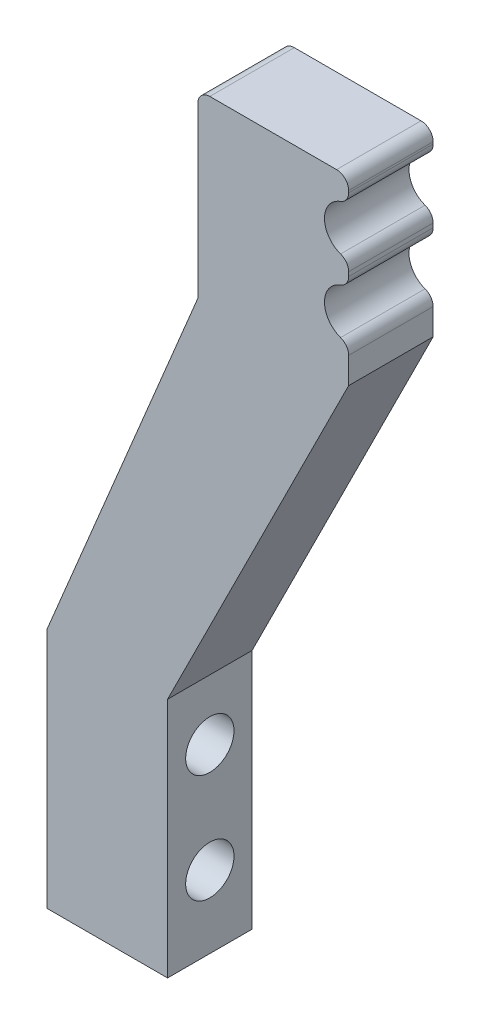
ISO-10303-21;
HEADER;
FILE_DESCRIPTION(('STEP AP214'),'2;1');
FILE_NAME('part.step','',(''),(''),'','','');
FILE_SCHEMA(('AUTOMOTIVE_DESIGN { 1 0 10303 214 1 1 1 1 }'));
ENDSEC;
DATA;
#1=APPLICATION_CONTEXT('core data for automotive mechanical design processes');
#2=APPLICATION_PROTOCOL_DEFINITION('international standard','automotive_design',2000,#1);
#3=PRODUCT_CONTEXT('',#1,'mechanical');
#4=PRODUCT('Part','Part','',(#3));
#5=PRODUCT_RELATED_PRODUCT_CATEGORY('part','',(#4));
#6=PRODUCT_DEFINITION_FORMATION('','',#4);
#7=PRODUCT_DEFINITION_CONTEXT('part definition',#1,'design');
#8=PRODUCT_DEFINITION('design','',#6,#7);
#9=PRODUCT_DEFINITION_SHAPE('','',#8);
#10=(LENGTH_UNIT() NAMED_UNIT(*) SI_UNIT(.MILLI.,.METRE.));
#11=(NAMED_UNIT(*) PLANE_ANGLE_UNIT() SI_UNIT($,.RADIAN.));
#12=(NAMED_UNIT(*) SI_UNIT($,.STERADIAN.) SOLID_ANGLE_UNIT());
#13=UNCERTAINTY_MEASURE_WITH_UNIT(LENGTH_MEASURE(1.E-05),#10,'distance_accuracy_value','');
#14=(GEOMETRIC_REPRESENTATION_CONTEXT(3) GLOBAL_UNCERTAINTY_ASSIGNED_CONTEXT((#13)) GLOBAL_UNIT_ASSIGNED_CONTEXT((#10,
#11,#12)) REPRESENTATION_CONTEXT('',''));
#15=CARTESIAN_POINT('',(0.,0.,0.));
#16=DIRECTION('',(0.,0.,1.));
#17=DIRECTION('',(1.,0.,0.));
#18=AXIS2_PLACEMENT_3D('',#15,#16,#17);
#19=CARTESIAN_POINT('',(-12.2781065088758,244.304733727811,70.));
#20=DIRECTION('',(-1.,0.,0.));
#21=DIRECTION('',(0.,0.,1.));
#22=AXIS2_PLACEMENT_3D('',#19,#20,#21);
#23=PLANE('',#22);
#24=DIRECTION('',(0.,0.,1.));
#25=VECTOR('',#24,1.);
#26=CARTESIAN_POINT('',(-12.2781065088758,234.304733727811,-9.00000000000001));
#27=LINE('',#26,#25);
#28=CARTESIAN_POINT('',(-12.2781065088758,234.304733727811,0.));
#29=VERTEX_POINT('',#28);
#30=CARTESIAN_POINT('',(-12.2781065088758,234.304733727811,70.));
#31=VERTEX_POINT('',#30);
#32=EDGE_CURVE('E52',#29,#31,#27,.T.);
#33=ORIENTED_EDGE('',*,*,#32,.T.);
#34=DIRECTION('',(0.,1.,0.));
#35=VECTOR('',#34,1.);
#36=CARTESIAN_POINT('',(-12.2781065088758,244.304733727811,70.));
#37=LINE('',#36,#35);
#38=CARTESIAN_POINT('',(-12.2781065088758,232.589004975272,70.));
#39=VERTEX_POINT('',#38);
#40=EDGE_CURVE('E171',#39,#31,#37,.T.);
#41=ORIENTED_EDGE('',*,*,#40,.F.);
#42=DIRECTION('',(0.,0.,1.));
#43=VECTOR('',#42,1.);
#44=CARTESIAN_POINT('',(-12.2781065088758,232.589004975272,-9.00000000000001));
#45=LINE('',#44,#43);
#46=CARTESIAN_POINT('',(-12.2781065088758,232.589004975272,0.));
#47=VERTEX_POINT('',#46);
#48=EDGE_CURVE('E263',#47,#39,#45,.T.);
#49=ORIENTED_EDGE('',*,*,#48,.F.);
#50=DIRECTION('',(0.,1.,0.));
#51=VECTOR('',#50,1.);
#52=CARTESIAN_POINT('',(-12.2781065088758,244.304733727811,0.));
#53=LINE('',#52,#51);
#54=EDGE_CURVE('E173',#47,#29,#53,.T.);
#55=ORIENTED_EDGE('',*,*,#54,.T.);
#56=EDGE_LOOP('',(#33,#41,#49,#55));
#57=FACE_BOUND('',#56,.T.);
#58=ADVANCED_FACE('F38',(#57),#23,.F.);
#59=DIRECTION('',(0.,0.,1.));
#60=VECTOR('',#59,1.);
#61=CARTESIAN_POINT('',(-12.2781065088757,176.020462480349,-9.00000000000001));
#62=LINE('',#61,#60);
#63=CARTESIAN_POINT('',(-12.2781065088757,176.020462480349,0.));
#64=VERTEX_POINT('',#63);
#65=CARTESIAN_POINT('',(-12.2781065088757,176.020462480349,70.));
#66=VERTEX_POINT('',#65);
#67=EDGE_CURVE('E258',#64,#66,#62,.T.);
#68=ORIENTED_EDGE('',*,*,#67,.T.);
#69=CARTESIAN_POINT('',(-12.2781065088757,172.589004975272,70.));
#70=VERTEX_POINT('',#69);
#71=EDGE_CURVE('E179',#70,#66,#37,.T.);
#72=ORIENTED_EDGE('',*,*,#71,.F.);
#73=DIRECTION('',(0.,0.,1.));
#74=VECTOR('',#73,1.);
#75=CARTESIAN_POINT('',(-12.2781065088757,172.589004975272,-9.00000000000001));
#76=LINE('',#75,#74);
#77=CARTESIAN_POINT('',(-12.2781065088757,172.589004975272,0.));
#78=VERTEX_POINT('',#77);
#79=EDGE_CURVE('E344',#78,#70,#76,.T.);
#80=ORIENTED_EDGE('',*,*,#79,.F.);
#81=EDGE_CURVE('E205',#78,#64,#53,.T.);
#82=ORIENTED_EDGE('',*,*,#81,.T.);
#83=EDGE_LOOP('',(#68,#72,#80,#82));
#84=FACE_BOUND('',#83,.T.);
#85=ADVANCED_FACE('F355',(#84),#23,.F.);
#86=DIRECTION('',(0.,0.,1.));
#87=VECTOR('',#86,1.);
#88=CARTESIAN_POINT('',(-12.2781065088758,116.020462480349,-9.00000000000001));
#89=LINE('',#88,#87);
#90=CARTESIAN_POINT('',(-12.2781065088758,116.020462480349,0.));
#91=VERTEX_POINT('',#90);
#92=CARTESIAN_POINT('',(-12.2781065088758,116.020462480349,70.));
#93=VERTEX_POINT('',#92);
#94=EDGE_CURVE('E338',#91,#93,#89,.T.);
#95=ORIENTED_EDGE('',*,*,#94,.T.);
#96=CARTESIAN_POINT('',(-12.2781065088758,94.3047337278106,70.));
#97=VERTEX_POINT('',#96);
#98=EDGE_CURVE('E182',#97,#93,#37,.T.);
#99=ORIENTED_EDGE('',*,*,#98,.F.);
#100=DIRECTION('',(0.,0.,1.));
#101=VECTOR('',#100,1.);
#102=CARTESIAN_POINT('',(-12.2781065088758,94.3047337278106,-62.));
#103=LINE('',#102,#101);
#104=CARTESIAN_POINT('',(-12.2781065088758,94.3047337278106,0.));
#105=VERTEX_POINT('',#104);
#106=EDGE_CURVE('E281',#105,#97,#103,.T.);
#107=ORIENTED_EDGE('',*,*,#106,.F.);
#108=EDGE_CURVE('E201',#105,#91,#53,.T.);
#109=ORIENTED_EDGE('',*,*,#108,.T.);
#110=EDGE_LOOP('',(#95,#99,#107,#109));
#111=FACE_BOUND('',#110,.T.);
#112=ADVANCED_FACE('F337',(#111),#23,.F.);
#113=CARTESIAN_POINT('',(-137.278106508876,244.304733727811,70.));
#114=DIRECTION('',(0.,-1.,0.));
#115=DIRECTION('',(0.,0.,-1.));
#116=AXIS2_PLACEMENT_3D('',#113,#114,#115);
#117=PLANE('',#116);
#118=DIRECTION('',(-1.,0.,0.));
#119=VECTOR('',#118,1.);
#120=CARTESIAN_POINT('',(-137.278106508876,244.304733727811,70.));
#121=LINE('',#120,#119);
#122=CARTESIAN_POINT('',(-22.2781065088759,244.304733727811,70.));
#123=VERTEX_POINT('',#122);
#124=CARTESIAN_POINT('',(-127.278106508876,244.304733727811,70.));
#125=VERTEX_POINT('',#124);
#126=EDGE_CURVE('E189',#123,#125,#121,.T.);
#127=ORIENTED_EDGE('',*,*,#126,.F.);
#128=DIRECTION('',(0.,0.,1.));
#129=VECTOR('',#128,1.);
#130=CARTESIAN_POINT('',(-22.2781065088759,244.304733727811,-9.00000000000001));
#131=LINE('',#130,#129);
#132=CARTESIAN_POINT('',(-22.2781065088759,244.304733727811,0.));
#133=VERTEX_POINT('',#132);
#134=EDGE_CURVE('E162',#133,#123,#131,.T.);
#135=ORIENTED_EDGE('',*,*,#134,.F.);
#136=DIRECTION('',(-1.,0.,0.));
#137=VECTOR('',#136,1.);
#138=CARTESIAN_POINT('',(-137.278106508876,244.304733727811,0.));
#139=LINE('',#138,#137);
#140=CARTESIAN_POINT('',(-127.278106508876,244.304733727811,0.));
#141=VERTEX_POINT('',#140);
#142=EDGE_CURVE('E204',#133,#141,#139,.T.);
#143=ORIENTED_EDGE('',*,*,#142,.T.);
#144=DIRECTION('',(0.,0.,1.));
#145=VECTOR('',#144,1.);
#146=CARTESIAN_POINT('',(-127.278106508876,244.304733727811,-9.00000000000001));
#147=LINE('',#146,#145);
#148=EDGE_CURVE('E270',#141,#125,#147,.T.);
#149=ORIENTED_EDGE('',*,*,#148,.T.);
#150=EDGE_LOOP('',(#127,#135,#143,#149));
#151=FACE_BOUND('',#150,.T.);
#152=ADVANCED_FACE('F375',(#151),#117,.F.);
#153=CARTESIAN_POINT('',(-137.278106508876,244.304733727811,70.));
#154=DIRECTION('',(1.,0.,0.));
#155=DIRECTION('',(0.,1.,0.));
#156=AXIS2_PLACEMENT_3D('',#153,#154,#155);
#157=PLANE('',#156);
#158=DIRECTION('',(0.,-1.,0.));
#159=VECTOR('',#158,1.);
#160=CARTESIAN_POINT('',(-137.278106508876,244.304733727811,70.));
#161=LINE('',#160,#159);
#162=CARTESIAN_POINT('',(-137.278106508876,234.304733727811,70.));
#163=VERTEX_POINT('',#162);
#164=CARTESIAN_POINT('',(-137.278106508876,94.3047337278106,70.));
#165=VERTEX_POINT('',#164);
#166=EDGE_CURVE('E193',#163,#165,#161,.T.);
#167=ORIENTED_EDGE('',*,*,#166,.F.);
#168=DIRECTION('',(0.,0.,1.));
#169=VECTOR('',#168,1.);
#170=CARTESIAN_POINT('',(-137.278106508876,234.304733727811,-9.00000000000001));
#171=LINE('',#170,#169);
#172=CARTESIAN_POINT('',(-137.278106508876,234.304733727811,0.));
#173=VERTEX_POINT('',#172);
#174=EDGE_CURVE('E271',#173,#163,#171,.T.);
#175=ORIENTED_EDGE('',*,*,#174,.F.);
#176=DIRECTION('',(0.,-1.,0.));
#177=VECTOR('',#176,1.);
#178=CARTESIAN_POINT('',(-137.278106508876,244.304733727811,0.));
#179=LINE('',#178,#177);
#180=CARTESIAN_POINT('',(-137.278106508876,94.3047337278106,0.));
#181=VERTEX_POINT('',#180);
#182=EDGE_CURVE('E184',#173,#181,#179,.T.);
#183=ORIENTED_EDGE('',*,*,#182,.T.);
#184=DIRECTION('',(0.,0.,-1.));
#185=VECTOR('',#184,1.);
#186=CARTESIAN_POINT('',(-137.278106508876,94.3047337278106,70.));
#187=LINE('',#186,#185);
#188=EDGE_CURVE('E210',#165,#181,#187,.T.);
#189=ORIENTED_EDGE('',*,*,#188,.F.);
#190=EDGE_LOOP('',(#167,#175,#183,#189));
#191=FACE_BOUND('',#190,.T.);
#192=ADVANCED_FACE('F379',(#191),#157,.F.);
#193=CARTESIAN_POINT('',(-137.278106508876,94.3047337278106,70.));
#194=DIRECTION('',(0.923076923076923,-0.384615384615385,0.));
#195=DIRECTION('',(0.384615384615385,0.923076923076923,0.));
#196=AXIS2_PLACEMENT_3D('',#193,#194,#195);
#197=PLANE('',#196);
#198=DIRECTION('',(-0.384615384615385,-0.923076923076923,0.));
#199=VECTOR('',#198,1.);
#200=CARTESIAN_POINT('',(-137.278106508876,94.3047337278106,0.));
#201=LINE('',#200,#199);
#202=CARTESIAN_POINT('',(-262.278106508876,-205.695266272189,0.));
#203=VERTEX_POINT('',#202);
#204=EDGE_CURVE('E180',#181,#203,#201,.T.);
#205=ORIENTED_EDGE('',*,*,#204,.T.);
#206=DIRECTION('',(0.,0.,-1.));
#207=VECTOR('',#206,1.);
#208=CARTESIAN_POINT('',(-262.278106508876,-205.695266272189,70.));
#209=LINE('',#208,#207);
#210=CARTESIAN_POINT('',(-262.278106508876,-205.695266272189,70.));
#211=VERTEX_POINT('',#210);
#212=EDGE_CURVE('E200',#211,#203,#209,.T.);
#213=ORIENTED_EDGE('',*,*,#212,.F.);
#214=DIRECTION('',(-0.384615384615385,-0.923076923076923,0.));
#215=VECTOR('',#214,1.);
#216=CARTESIAN_POINT('',(-137.278106508876,94.3047337278106,70.));
#217=LINE('',#216,#215);
#218=EDGE_CURVE('E196',#165,#211,#217,.T.);
#219=ORIENTED_EDGE('',*,*,#218,.F.);
#220=ORIENTED_EDGE('',*,*,#188,.T.);
#221=EDGE_LOOP('',(#205,#213,#219,#220));
#222=FACE_BOUND('',#221,.T.);
#223=ADVANCED_FACE('F327',(#222),#197,.F.);
#224=CARTESIAN_POINT('',(0.,0.,70.));
#225=DIRECTION('',(0.,0.,1.));
#226=DIRECTION('',(1.,0.,0.));
#227=AXIS2_PLACEMENT_3D('',#224,#225,#226);
#228=PLANE('',#227);
#229=CARTESIAN_POINT('',(-22.2781065088758,234.304733727811,70.));
#230=DIRECTION('',(0.,0.,-1.));
#231=DIRECTION('',(1.,0.,0.));
#232=AXIS2_PLACEMENT_3D('',#229,#230,#231);
#233=CIRCLE('',#232,10.);
#234=EDGE_CURVE('E159',#123,#31,#233,.T.);
#235=ORIENTED_EDGE('',*,*,#234,.F.);
#236=ORIENTED_EDGE('',*,*,#126,.T.);
#237=CARTESIAN_POINT('',(-127.278106508876,234.304733727811,70.));
#238=DIRECTION('',(0.,0.,-1.));
#239=DIRECTION('',(-1.,0.,0.));
#240=AXIS2_PLACEMENT_3D('',#237,#238,#239);
#241=CIRCLE('',#240,10.);
#242=EDGE_CURVE('E268',#163,#125,#241,.T.);
#243=ORIENTED_EDGE('',*,*,#242,.F.);
#244=ORIENTED_EDGE('',*,*,#166,.T.);
#245=ORIENTED_EDGE('',*,*,#218,.T.);
#246=DIRECTION('',(0.,-1.,0.));
#247=VECTOR('',#246,1.);
#248=CARTESIAN_POINT('',(-262.278106508876,-205.695266272189,70.));
#249=LINE('',#248,#247);
#250=CARTESIAN_POINT('',(-262.278106508876,-405.695266272189,70.));
#251=VERTEX_POINT('',#250);
#252=EDGE_CURVE('E221',#211,#251,#249,.T.);
#253=ORIENTED_EDGE('',*,*,#252,.T.);
#254=DIRECTION('',(1.,0.,0.));
#255=VECTOR('',#254,1.);
#256=CARTESIAN_POINT('',(-262.278106508876,-405.695266272189,70.));
#257=LINE('',#256,#255);
#258=CARTESIAN_POINT('',(-162.278106508876,-405.695266272189,70.));
#259=VERTEX_POINT('',#258);
#260=EDGE_CURVE('E304',#251,#259,#257,.T.);
#261=ORIENTED_EDGE('',*,*,#260,.T.);
#262=DIRECTION('',(0.,1.,0.));
#263=VECTOR('',#262,1.);
#264=CARTESIAN_POINT('',(-162.278106508876,-405.695266272189,70.));
#265=LINE('',#264,#263);
#266=CARTESIAN_POINT('',(-162.278106508876,-205.695266272189,70.));
#267=VERTEX_POINT('',#266);
#268=EDGE_CURVE('E295',#259,#267,#265,.T.);
#269=ORIENTED_EDGE('',*,*,#268,.T.);
#270=DIRECTION('',(-0.447213595499958,-0.894427190999916,0.));
#271=VECTOR('',#270,1.);
#272=CARTESIAN_POINT('',(-162.278106508876,-205.695266272189,70.));
#273=LINE('',#272,#271);
#274=EDGE_CURVE('E278',#97,#267,#273,.T.);
#275=ORIENTED_EDGE('',*,*,#274,.F.);
#276=ORIENTED_EDGE('',*,*,#98,.T.);
#277=CARTESIAN_POINT('',(-22.2781065088758,116.020462480349,70.));
#278=DIRECTION('',(0.,0.,-1.));
#279=DIRECTION('',(1.,0.,0.));
#280=AXIS2_PLACEMENT_3D('',#277,#278,#279);
#281=CIRCLE('',#280,10.);
#282=CARTESIAN_POINT('',(-18.9447731755424,125.448552896169,70.));
#283=VERTEX_POINT('',#282);
#284=EDGE_CURVE('E339',#283,#93,#281,.T.);
#285=ORIENTED_EDGE('',*,*,#284,.F.);
#286=CARTESIAN_POINT('',(-12.2781065088758,144.304733727811,70.));
#287=DIRECTION('',(0.,0.,1.));
#288=DIRECTION('',(1.,0.,0.));
#289=AXIS2_PLACEMENT_3D('',#286,#287,#288);
#290=CIRCLE('',#289,20.);
#291=CARTESIAN_POINT('',(-18.9447731755424,163.160914559452,70.));
#292=VERTEX_POINT('',#291);
#293=EDGE_CURVE('E243',#292,#283,#290,.T.);
#294=ORIENTED_EDGE('',*,*,#293,.F.);
#295=CARTESIAN_POINT('',(-22.2781065088757,172.589004975273,70.));
#296=DIRECTION('',(0.,0.,-1.));
#297=DIRECTION('',(1.,0.,0.));
#298=AXIS2_PLACEMENT_3D('',#295,#296,#297);
#299=CIRCLE('',#298,10.);
#300=EDGE_CURVE('E340',#70,#292,#299,.T.);
#301=ORIENTED_EDGE('',*,*,#300,.F.);
#302=ORIENTED_EDGE('',*,*,#71,.T.);
#303=CARTESIAN_POINT('',(-22.2781065088757,176.020462480349,70.));
#304=DIRECTION('',(0.,0.,-1.));
#305=DIRECTION('',(1.,0.,0.));
#306=AXIS2_PLACEMENT_3D('',#303,#304,#305);
#307=CIRCLE('',#306,10.);
#308=CARTESIAN_POINT('',(-18.9447731755424,185.448552896169,70.));
#309=VERTEX_POINT('',#308);
#310=EDGE_CURVE('E342',#309,#66,#307,.T.);
#311=ORIENTED_EDGE('',*,*,#310,.F.);
#312=CARTESIAN_POINT('',(-12.2781065088758,204.304733727811,70.));
#313=DIRECTION('',(0.,0.,1.));
#314=DIRECTION('',(1.,0.,0.));
#315=AXIS2_PLACEMENT_3D('',#312,#313,#314);
#316=CIRCLE('',#315,20.);
#317=CARTESIAN_POINT('',(-18.9447731755425,223.160914559452,70.));
#318=VERTEX_POINT('',#317);
#319=EDGE_CURVE('E275',#318,#309,#316,.T.);
#320=ORIENTED_EDGE('',*,*,#319,.F.);
#321=CARTESIAN_POINT('',(-22.2781065088758,232.589004975273,70.));
#322=DIRECTION('',(0.,0.,-1.));
#323=DIRECTION('',(1.,0.,0.));
#324=AXIS2_PLACEMENT_3D('',#321,#322,#323);
#325=CIRCLE('',#324,10.);
#326=EDGE_CURVE('E178',#39,#318,#325,.T.);
#327=ORIENTED_EDGE('',*,*,#326,.F.);
#328=ORIENTED_EDGE('',*,*,#40,.T.);
#329=EDGE_LOOP('',(#235,#236,#243,#244,#245,#253,#261,#269,#275,#276,#285,#294,#301,#302,#311,
#320,#327,#328));
#330=FACE_BOUND('',#329,.T.);
#331=ADVANCED_FACE('F176',(#330),#228,.T.);
#332=CARTESIAN_POINT('',(0.,0.,0.));
#333=DIRECTION('',(0.,0.,1.));
#334=DIRECTION('',(1.,0.,0.));
#335=AXIS2_PLACEMENT_3D('',#332,#333,#334);
#336=PLANE('',#335);
#337=ORIENTED_EDGE('',*,*,#142,.F.);
#338=CARTESIAN_POINT('',(-22.2781065088758,234.304733727811,0.));
#339=DIRECTION('',(0.,0.,1.));
#340=DIRECTION('',(1.,0.,0.));
#341=AXIS2_PLACEMENT_3D('',#338,#339,#340);
#342=CIRCLE('',#341,10.);
#343=EDGE_CURVE('E11',#133,#29,#342,.F.);
#344=ORIENTED_EDGE('',*,*,#343,.T.);
#345=ORIENTED_EDGE('',*,*,#54,.F.);
#346=CARTESIAN_POINT('',(-22.2781065088758,232.589004975273,0.));
#347=DIRECTION('',(0.,0.,1.));
#348=DIRECTION('',(1.,0.,0.));
#349=AXIS2_PLACEMENT_3D('',#346,#347,#348);
#350=CIRCLE('',#349,10.);
#351=CARTESIAN_POINT('',(-18.9447731755425,223.160914559452,0.));
#352=VERTEX_POINT('',#351);
#353=EDGE_CURVE('E265',#47,#352,#350,.F.);
#354=ORIENTED_EDGE('',*,*,#353,.T.);
#355=CARTESIAN_POINT('',(-12.2781065088758,204.304733727811,0.));
#356=DIRECTION('',(0.,0.,1.));
#357=DIRECTION('',(1.,0.,0.));
#358=AXIS2_PLACEMENT_3D('',#355,#356,#357);
#359=CIRCLE('',#358,20.);
#360=CARTESIAN_POINT('',(-18.9447731755424,185.448552896169,0.));
#361=VERTEX_POINT('',#360);
#362=EDGE_CURVE('E224',#352,#361,#359,.T.);
#363=ORIENTED_EDGE('',*,*,#362,.T.);
#364=CARTESIAN_POINT('',(-22.2781065088757,176.020462480349,0.));
#365=DIRECTION('',(0.,0.,1.));
#366=DIRECTION('',(1.,0.,0.));
#367=AXIS2_PLACEMENT_3D('',#364,#365,#366);
#368=CIRCLE('',#367,10.);
#369=EDGE_CURVE('E255',#361,#64,#368,.F.);
#370=ORIENTED_EDGE('',*,*,#369,.T.);
#371=ORIENTED_EDGE('',*,*,#81,.F.);
#372=CARTESIAN_POINT('',(-22.2781065088757,172.589004975273,0.));
#373=DIRECTION('',(0.,0.,1.));
#374=DIRECTION('',(1.,0.,0.));
#375=AXIS2_PLACEMENT_3D('',#372,#373,#374);
#376=CIRCLE('',#375,10.);
#377=CARTESIAN_POINT('',(-18.9447731755424,163.160914559452,0.));
#378=VERTEX_POINT('',#377);
#379=EDGE_CURVE('E250',#78,#378,#376,.F.);
#380=ORIENTED_EDGE('',*,*,#379,.T.);
#381=CARTESIAN_POINT('',(-12.2781065088758,144.304733727811,0.));
#382=DIRECTION('',(0.,0.,1.));
#383=DIRECTION('',(1.,0.,0.));
#384=AXIS2_PLACEMENT_3D('',#381,#382,#383);
#385=CIRCLE('',#384,20.);
#386=CARTESIAN_POINT('',(-18.9447731755423,125.448552896169,0.));
#387=VERTEX_POINT('',#386);
#388=EDGE_CURVE('E213',#378,#387,#385,.T.);
#389=ORIENTED_EDGE('',*,*,#388,.T.);
#390=CARTESIAN_POINT('',(-22.2781065088758,116.020462480349,0.));
#391=DIRECTION('',(0.,0.,1.));
#392=DIRECTION('',(1.,0.,0.));
#393=AXIS2_PLACEMENT_3D('',#390,#391,#392);
#394=CIRCLE('',#393,10.);
#395=EDGE_CURVE('E59',#387,#91,#394,.F.);
#396=ORIENTED_EDGE('',*,*,#395,.T.);
#397=ORIENTED_EDGE('',*,*,#108,.F.);
#398=DIRECTION('',(-0.447213595499958,-0.894427190999916,0.));
#399=VECTOR('',#398,1.);
#400=CARTESIAN_POINT('',(-47.5443786982249,23.7721893491124,0.));
#401=LINE('',#400,#399);
#402=CARTESIAN_POINT('',(-162.278106508876,-205.695266272189,0.));
#403=VERTEX_POINT('',#402);
#404=EDGE_CURVE('E283',#105,#403,#401,.T.);
#405=ORIENTED_EDGE('',*,*,#404,.T.);
#406=DIRECTION('',(0.,1.,0.));
#407=VECTOR('',#406,1.);
#408=CARTESIAN_POINT('',(-162.278106508876,-405.695266272189,0.));
#409=LINE('',#408,#407);
#410=CARTESIAN_POINT('',(-162.278106508876,-405.695266272189,0.));
#411=VERTEX_POINT('',#410);
#412=EDGE_CURVE('E298',#411,#403,#409,.T.);
#413=ORIENTED_EDGE('',*,*,#412,.F.);
#414=DIRECTION('',(1.,0.,0.));
#415=VECTOR('',#414,1.);
#416=CARTESIAN_POINT('',(-262.278106508876,-405.695266272189,0.));
#417=LINE('',#416,#415);
#418=CARTESIAN_POINT('',(-262.278106508876,-405.695266272189,0.));
#419=VERTEX_POINT('',#418);
#420=EDGE_CURVE('E294',#419,#411,#417,.T.);
#421=ORIENTED_EDGE('',*,*,#420,.F.);
#422=DIRECTION('',(0.,-1.,0.));
#423=VECTOR('',#422,1.);
#424=CARTESIAN_POINT('',(-262.278106508876,-205.695266272189,0.));
#425=LINE('',#424,#423);
#426=EDGE_CURVE('E291',#203,#419,#425,.T.);
#427=ORIENTED_EDGE('',*,*,#426,.F.);
#428=ORIENTED_EDGE('',*,*,#204,.F.);
#429=ORIENTED_EDGE('',*,*,#182,.F.);
#430=CARTESIAN_POINT('',(-127.278106508876,234.304733727811,0.));
#431=DIRECTION('',(0.,0.,1.));
#432=DIRECTION('',(1.,0.,0.));
#433=AXIS2_PLACEMENT_3D('',#430,#431,#432);
#434=CIRCLE('',#433,10.);
#435=EDGE_CURVE('E227',#173,#141,#434,.F.);
#436=ORIENTED_EDGE('',*,*,#435,.T.);
#437=EDGE_LOOP('',(#337,#344,#345,#354,#363,#370,#371,#380,#389,#396,#397,#405,#413,#421,#427,
#428,#429,#436));
#438=FACE_BOUND('',#437,.T.);
#439=ADVANCED_FACE('F247',(#438),#336,.F.);
#440=CARTESIAN_POINT('',(-162.278106508876,-405.695266272189,0.));
#441=DIRECTION('',(1.,0.,0.));
#442=DIRECTION('',(0.,0.,-1.));
#443=AXIS2_PLACEMENT_3D('',#440,#441,#442);
#444=PLANE('',#443);
#445=CARTESIAN_POINT('',(-162.278106508876,-345.695266272189,35.));
#446=DIRECTION('',(1.,0.,0.));
#447=DIRECTION('',(0.,0.,-1.));
#448=AXIS2_PLACEMENT_3D('',#445,#446,#447);
#449=CIRCLE('',#448,20.);
#450=CARTESIAN_POINT('',(-162.278106508876,-345.695266272189,15.));
#451=VERTEX_POINT('',#450);
#452=EDGE_CURVE('E218',#451,#451,#449,.T.);
#453=ORIENTED_EDGE('',*,*,#452,.F.);
#454=EDGE_LOOP('',(#453));
#455=FACE_BOUND('',#454,.T.);
#456=CARTESIAN_POINT('',(-162.278106508876,-255.695266272189,35.));
#457=DIRECTION('',(1.,0.,0.));
#458=DIRECTION('',(0.,0.,-1.));
#459=AXIS2_PLACEMENT_3D('',#456,#457,#458);
#460=CIRCLE('',#459,20.);
#461=CARTESIAN_POINT('',(-162.278106508876,-255.695266272189,15.));
#462=VERTEX_POINT('',#461);
#463=EDGE_CURVE('E286',#462,#462,#460,.T.);
#464=ORIENTED_EDGE('',*,*,#463,.F.);
#465=EDGE_LOOP('',(#464));
#466=FACE_BOUND('',#465,.T.);
#467=ORIENTED_EDGE('',*,*,#268,.F.);
#468=DIRECTION('',(0.,0.,1.));
#469=VECTOR('',#468,1.);
#470=CARTESIAN_POINT('',(-162.278106508876,-405.695266272189,0.));
#471=LINE('',#470,#469);
#472=EDGE_CURVE('E312',#411,#259,#471,.T.);
#473=ORIENTED_EDGE('',*,*,#472,.F.);
#474=ORIENTED_EDGE('',*,*,#412,.T.);
#475=DIRECTION('',(0.,0.,1.));
#476=VECTOR('',#475,1.);
#477=CARTESIAN_POINT('',(-162.278106508876,-205.695266272189,0.));
#478=LINE('',#477,#476);
#479=EDGE_CURVE('E309',#403,#267,#478,.T.);
#480=ORIENTED_EDGE('',*,*,#479,.T.);
#481=EDGE_LOOP('',(#467,#473,#474,#480));
#482=FACE_BOUND('',#481,.T.);
#483=ADVANCED_FACE('F332',(#455,#466,#482),#444,.T.);
#484=CARTESIAN_POINT('',(-262.278106508876,-405.695266272189,0.));
#485=DIRECTION('',(0.,-1.,0.));
#486=DIRECTION('',(0.,0.,-1.));
#487=AXIS2_PLACEMENT_3D('',#484,#485,#486);
#488=PLANE('',#487);
#489=ORIENTED_EDGE('',*,*,#260,.F.);
#490=DIRECTION('',(0.,0.,1.));
#491=VECTOR('',#490,1.);
#492=CARTESIAN_POINT('',(-262.278106508876,-405.695266272189,0.));
#493=LINE('',#492,#491);
#494=EDGE_CURVE('E301',#419,#251,#493,.T.);
#495=ORIENTED_EDGE('',*,*,#494,.F.);
#496=ORIENTED_EDGE('',*,*,#420,.T.);
#497=ORIENTED_EDGE('',*,*,#472,.T.);
#498=EDGE_LOOP('',(#489,#495,#496,#497));
#499=FACE_BOUND('',#498,.T.);
#500=ADVANCED_FACE('F320',(#499),#488,.T.);
#501=CARTESIAN_POINT('',(-262.278106508876,-205.695266272189,0.));
#502=DIRECTION('',(-1.,0.,0.));
#503=DIRECTION('',(0.,0.,1.));
#504=AXIS2_PLACEMENT_3D('',#501,#502,#503);
#505=PLANE('',#504);
#506=CARTESIAN_POINT('',(-262.278106508876,-345.695266272189,35.));
#507=DIRECTION('',(-1.,0.,0.));
#508=DIRECTION('',(0.,0.,1.));
#509=AXIS2_PLACEMENT_3D('',#506,#507,#508);
#510=CIRCLE('',#509,20.);
#511=CARTESIAN_POINT('',(-262.278106508876,-345.695266272189,55.));
#512=VERTEX_POINT('',#511);
#513=EDGE_CURVE('E217',#512,#512,#510,.T.);
#514=ORIENTED_EDGE('',*,*,#513,.F.);
#515=EDGE_LOOP('',(#514));
#516=FACE_BOUND('',#515,.T.);
#517=CARTESIAN_POINT('',(-262.278106508876,-255.695266272189,35.));
#518=DIRECTION('',(-1.,0.,0.));
#519=DIRECTION('',(0.,0.,1.));
#520=AXIS2_PLACEMENT_3D('',#517,#518,#519);
#521=CIRCLE('',#520,20.);
#522=CARTESIAN_POINT('',(-262.278106508876,-255.695266272189,55.));
#523=VERTEX_POINT('',#522);
#524=EDGE_CURVE('E214',#523,#523,#521,.T.);
#525=ORIENTED_EDGE('',*,*,#524,.F.);
#526=EDGE_LOOP('',(#525));
#527=FACE_BOUND('',#526,.T.);
#528=ORIENTED_EDGE('',*,*,#252,.F.);
#529=ORIENTED_EDGE('',*,*,#212,.T.);
#530=ORIENTED_EDGE('',*,*,#426,.T.);
#531=ORIENTED_EDGE('',*,*,#494,.T.);
#532=EDGE_LOOP('',(#528,#529,#530,#531));
#533=FACE_BOUND('',#532,.T.);
#534=ADVANCED_FACE('F316',(#516,#527,#533),#505,.T.);
#535=CARTESIAN_POINT('',(-294.278106508876,-255.695266272189,35.));
#536=DIRECTION('',(1.,0.,0.));
#537=DIRECTION('',(0.,0.,-1.));
#538=AXIS2_PLACEMENT_3D('',#535,#536,#537);
#539=CYLINDRICAL_SURFACE('',#538,20.);
#540=ORIENTED_EDGE('',*,*,#524,.T.);
#541=EDGE_LOOP('',(#540));
#542=FACE_BOUND('',#541,.T.);
#543=ORIENTED_EDGE('',*,*,#463,.T.);
#544=EDGE_LOOP('',(#543));
#545=FACE_BOUND('',#544,.T.);
#546=ADVANCED_FACE('F395',(#542,#545),#539,.F.);
#547=CARTESIAN_POINT('',(-294.278106508876,-345.695266272189,35.));
#548=DIRECTION('',(1.,0.,0.));
#549=DIRECTION('',(0.,0.,-1.));
#550=AXIS2_PLACEMENT_3D('',#547,#548,#549);
#551=CYLINDRICAL_SURFACE('',#550,20.);
#552=ORIENTED_EDGE('',*,*,#513,.T.);
#553=EDGE_LOOP('',(#552));
#554=FACE_BOUND('',#553,.T.);
#555=ORIENTED_EDGE('',*,*,#452,.T.);
#556=EDGE_LOOP('',(#555));
#557=FACE_BOUND('',#556,.T.);
#558=ADVANCED_FACE('F404',(#554,#557),#551,.F.);
#559=CARTESIAN_POINT('',(-162.278106508876,-205.695266272189,-62.));
#560=DIRECTION('',(-0.894427190999916,0.447213595499958,0.));
#561=DIRECTION('',(-0.447213595499958,-0.894427190999916,0.));
#562=AXIS2_PLACEMENT_3D('',#559,#560,#561);
#563=PLANE('',#562);
#564=ORIENTED_EDGE('',*,*,#106,.T.);
#565=ORIENTED_EDGE('',*,*,#274,.T.);
#566=ORIENTED_EDGE('',*,*,#479,.F.);
#567=ORIENTED_EDGE('',*,*,#404,.F.);
#568=EDGE_LOOP('',(#564,#565,#566,#567));
#569=FACE_BOUND('',#568,.T.);
#570=ADVANCED_FACE('F408',(#569),#563,.F.);
#571=CARTESIAN_POINT('',(-12.2781065088758,144.304733727811,-62.));
#572=DIRECTION('',(0.,0.,1.));
#573=DIRECTION('',(1.,0.,0.));
#574=AXIS2_PLACEMENT_3D('',#571,#572,#573);
#575=CYLINDRICAL_SURFACE('',#574,20.);
#576=ORIENTED_EDGE('',*,*,#293,.T.);
#577=DIRECTION('',(0.,0.,1.));
#578=VECTOR('',#577,1.);
#579=CARTESIAN_POINT('',(-18.9447731755423,125.448552896169,-62.));
#580=LINE('',#579,#578);
#581=EDGE_CURVE('E45',#283,#387,#580,.F.);
#582=ORIENTED_EDGE('',*,*,#581,.T.);
#583=ORIENTED_EDGE('',*,*,#388,.F.);
#584=DIRECTION('',(0.,0.,1.));
#585=VECTOR('',#584,1.);
#586=CARTESIAN_POINT('',(-18.9447731755424,163.160914559452,-62.));
#587=LINE('',#586,#585);
#588=EDGE_CURVE('E236',#378,#292,#587,.T.);
#589=ORIENTED_EDGE('',*,*,#588,.T.);
#590=EDGE_LOOP('',(#576,#582,#583,#589));
#591=FACE_BOUND('',#590,.T.);
#592=ADVANCED_FACE('F241',(#591),#575,.F.);
#593=CARTESIAN_POINT('',(-12.2781065088758,204.304733727811,-62.));
#594=DIRECTION('',(0.,0.,1.));
#595=DIRECTION('',(1.,0.,0.));
#596=AXIS2_PLACEMENT_3D('',#593,#594,#595);
#597=CYLINDRICAL_SURFACE('',#596,20.);
#598=ORIENTED_EDGE('',*,*,#319,.T.);
#599=DIRECTION('',(0.,0.,1.));
#600=VECTOR('',#599,1.);
#601=CARTESIAN_POINT('',(-18.9447731755424,185.448552896169,-62.));
#602=LINE('',#601,#600);
#603=EDGE_CURVE('E233',#309,#361,#602,.F.);
#604=ORIENTED_EDGE('',*,*,#603,.T.);
#605=ORIENTED_EDGE('',*,*,#362,.F.);
#606=DIRECTION('',(0.,0.,1.));
#607=VECTOR('',#606,1.);
#608=CARTESIAN_POINT('',(-18.9447731755425,223.160914559452,-62.));
#609=LINE('',#608,#607);
#610=EDGE_CURVE('E230',#352,#318,#609,.T.);
#611=ORIENTED_EDGE('',*,*,#610,.T.);
#612=EDGE_LOOP('',(#598,#604,#605,#611));
#613=FACE_BOUND('',#612,.T.);
#614=ADVANCED_FACE('F413',(#613),#597,.F.);
#615=CARTESIAN_POINT('',(-127.278106508876,234.304733727811,-9.00000000000001));
#616=DIRECTION('',(0.,0.,1.));
#617=DIRECTION('',(1.,0.,0.));
#618=AXIS2_PLACEMENT_3D('',#615,#616,#617);
#619=CYLINDRICAL_SURFACE('',#618,10.);
#620=ORIENTED_EDGE('',*,*,#174,.T.);
#621=ORIENTED_EDGE('',*,*,#242,.T.);
#622=ORIENTED_EDGE('',*,*,#148,.F.);
#623=ORIENTED_EDGE('',*,*,#435,.F.);
#624=EDGE_LOOP('',(#620,#621,#622,#623));
#625=FACE_BOUND('',#624,.T.);
#626=ADVANCED_FACE('F416',(#625),#619,.T.);
#627=CARTESIAN_POINT('',(-22.2781065088758,232.589004975273,-9.00000000000001));
#628=DIRECTION('',(0.,0.,1.));
#629=DIRECTION('',(1.,0.,0.));
#630=AXIS2_PLACEMENT_3D('',#627,#628,#629);
#631=CYLINDRICAL_SURFACE('',#630,10.);
#632=ORIENTED_EDGE('',*,*,#48,.T.);
#633=ORIENTED_EDGE('',*,*,#326,.T.);
#634=ORIENTED_EDGE('',*,*,#610,.F.);
#635=ORIENTED_EDGE('',*,*,#353,.F.);
#636=EDGE_LOOP('',(#632,#633,#634,#635));
#637=FACE_BOUND('',#636,.T.);
#638=ADVANCED_FACE('F366',(#637),#631,.T.);
#639=CARTESIAN_POINT('',(-22.2781065088757,176.020462480349,-9.00000000000001));
#640=DIRECTION('',(0.,0.,1.));
#641=DIRECTION('',(1.,0.,0.));
#642=AXIS2_PLACEMENT_3D('',#639,#640,#641);
#643=CYLINDRICAL_SURFACE('',#642,10.);
#644=ORIENTED_EDGE('',*,*,#603,.F.);
#645=ORIENTED_EDGE('',*,*,#310,.T.);
#646=ORIENTED_EDGE('',*,*,#67,.F.);
#647=ORIENTED_EDGE('',*,*,#369,.F.);
#648=EDGE_LOOP('',(#644,#645,#646,#647));
#649=FACE_BOUND('',#648,.T.);
#650=ADVANCED_FACE('F359',(#649),#643,.T.);
#651=CARTESIAN_POINT('',(-22.2781065088757,172.589004975273,-9.00000000000001));
#652=DIRECTION('',(0.,0.,1.));
#653=DIRECTION('',(1.,0.,0.));
#654=AXIS2_PLACEMENT_3D('',#651,#652,#653);
#655=CYLINDRICAL_SURFACE('',#654,10.);
#656=ORIENTED_EDGE('',*,*,#79,.T.);
#657=ORIENTED_EDGE('',*,*,#300,.T.);
#658=ORIENTED_EDGE('',*,*,#588,.F.);
#659=ORIENTED_EDGE('',*,*,#379,.F.);
#660=EDGE_LOOP('',(#656,#657,#658,#659));
#661=FACE_BOUND('',#660,.T.);
#662=ADVANCED_FACE('F356',(#661),#655,.T.);
#663=CARTESIAN_POINT('',(-22.2781065088758,116.020462480349,-9.00000000000001));
#664=DIRECTION('',(0.,0.,1.));
#665=DIRECTION('',(1.,0.,0.));
#666=AXIS2_PLACEMENT_3D('',#663,#664,#665);
#667=CYLINDRICAL_SURFACE('',#666,10.);
#668=ORIENTED_EDGE('',*,*,#581,.F.);
#669=ORIENTED_EDGE('',*,*,#284,.T.);
#670=ORIENTED_EDGE('',*,*,#94,.F.);
#671=ORIENTED_EDGE('',*,*,#395,.F.);
#672=EDGE_LOOP('',(#668,#669,#670,#671));
#673=FACE_BOUND('',#672,.T.);
#674=ADVANCED_FACE('F358',(#673),#667,.T.);
#675=CARTESIAN_POINT('',(-22.2781065088758,234.304733727811,-9.00000000000001));
#676=DIRECTION('',(0.,0.,1.));
#677=DIRECTION('',(1.,0.,0.));
#678=AXIS2_PLACEMENT_3D('',#675,#676,#677);
#679=CYLINDRICAL_SURFACE('',#678,10.);
#680=ORIENTED_EDGE('',*,*,#134,.T.);
#681=ORIENTED_EDGE('',*,*,#234,.T.);
#682=ORIENTED_EDGE('',*,*,#32,.F.);
#683=ORIENTED_EDGE('',*,*,#343,.F.);
#684=EDGE_LOOP('',(#680,#681,#682,#683));
#685=FACE_BOUND('',#684,.T.);
#686=ADVANCED_FACE('F160',(#685),#679,.T.);
#687=CLOSED_SHELL('',(#58,#85,#112,#152,#192,#223,#331,#439,#483,#500,#534,#546,#558,#570,#592,
#614,#626,#638,#650,#662,#674,#686));
#688=MANIFOLD_SOLID_BREP('B2',#687);
#689=ADVANCED_BREP_SHAPE_REPRESENTATION('',(#18,#688),#14);
#690=SHAPE_DEFINITION_REPRESENTATION(#9,#689);
ENDSEC;
END-ISO-10303-21;
